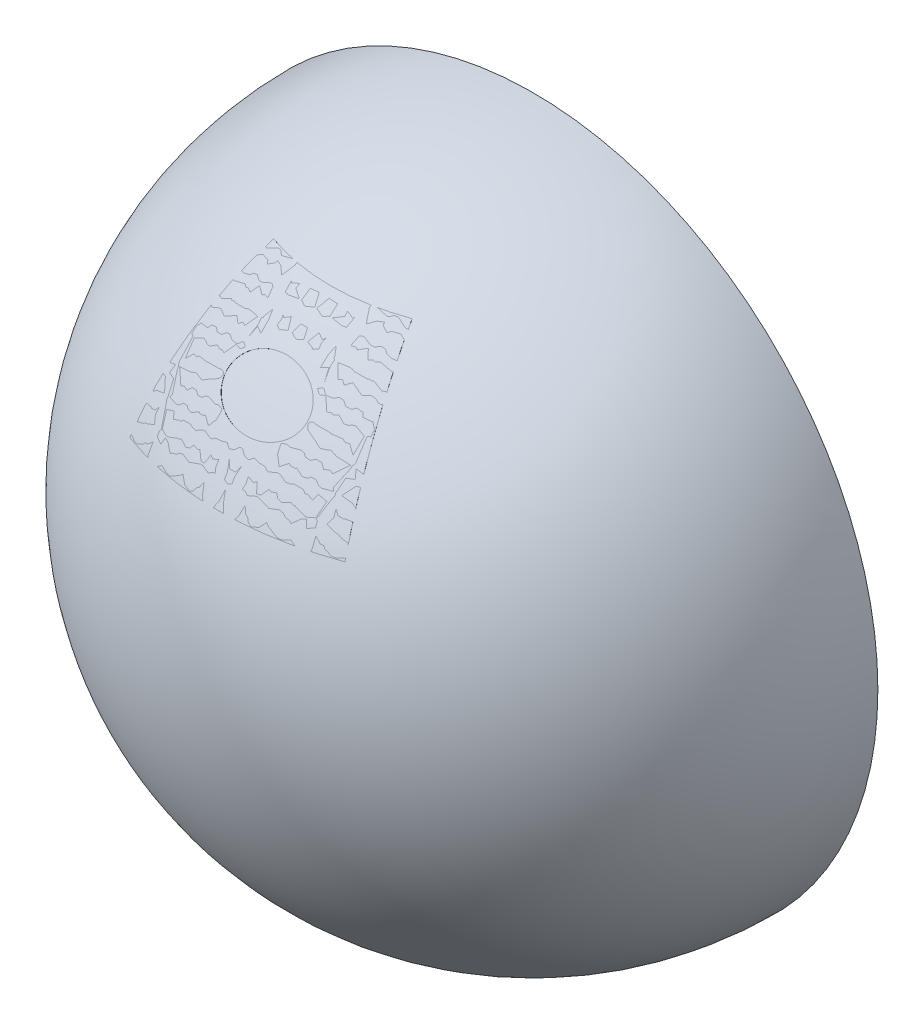
ISO-10303-21;
HEADER;
FILE_DESCRIPTION(('STEP AP214'),'2;1');
FILE_NAME('part.step','',(''),(''),'','','');
FILE_SCHEMA(('AUTOMOTIVE_DESIGN { 1 0 10303 214 1 1 1 1 }'));
ENDSEC;
DATA;
#1=APPLICATION_CONTEXT('core data for automotive mechanical design processes');
#2=APPLICATION_PROTOCOL_DEFINITION('international standard','automotive_design',2000,#1);
#3=PRODUCT_CONTEXT('',#1,'mechanical');
#4=PRODUCT('Part','Part','',(#3));
#5=PRODUCT_RELATED_PRODUCT_CATEGORY('part','',(#4));
#6=PRODUCT_DEFINITION_FORMATION('','',#4);
#7=PRODUCT_DEFINITION_CONTEXT('part definition',#1,'design');
#8=PRODUCT_DEFINITION('design','',#6,#7);
#9=PRODUCT_DEFINITION_SHAPE('','',#8);
#10=(LENGTH_UNIT() NAMED_UNIT(*) SI_UNIT(.MILLI.,.METRE.));
#11=(NAMED_UNIT(*) PLANE_ANGLE_UNIT() SI_UNIT($,.RADIAN.));
#12=(NAMED_UNIT(*) SI_UNIT($,.STERADIAN.) SOLID_ANGLE_UNIT());
#13=UNCERTAINTY_MEASURE_WITH_UNIT(LENGTH_MEASURE(1.E-05),#10,'distance_accuracy_value','');
#14=(GEOMETRIC_REPRESENTATION_CONTEXT(3) GLOBAL_UNCERTAINTY_ASSIGNED_CONTEXT((#13)) GLOBAL_UNIT_ASSIGNED_CONTEXT((#10,
#11,#12)) REPRESENTATION_CONTEXT('',''));
#15=CARTESIAN_POINT('',(0.,0.,0.));
#16=DIRECTION('',(0.,0.,1.));
#17=DIRECTION('',(1.,0.,0.));
#18=AXIS2_PLACEMENT_3D('',#15,#16,#17);
#19=CARTESIAN_POINT('',(0.,0.,0.));
#20=DIRECTION('',(0.,-1.,0.));
#21=DIRECTION('',(0.342020143325725,0.,0.939692620785888));
#22=AXIS2_PLACEMENT_3D('',#19,#20,#21);
#23=SPHERICAL_SURFACE('',#22,100.);
#24=CARTESIAN_POINT('',(0.,40.6615853437039,0.));
#25=DIRECTION('',(0.,-1.,0.));
#26=DIRECTION('',(0.,0.,-1.));
#27=AXIS2_PLACEMENT_3D('',#24,#25,#26);
#28=CIRCLE('',#27,91.3599227086838);
#29=CARTESIAN_POINT('',(31.2469338590512,40.6615853437039,85.8502452049193));
#30=VERTEX_POINT('',#29);
#31=CARTESIAN_POINT('',(-31.2469338590512,40.6615853437039,85.8502452049192));
#32=VERTEX_POINT('',#31);
#33=EDGE_CURVE('E62',#30,#32,#28,.T.);
#34=ORIENTED_EDGE('',*,*,#33,.F.);
#35=CARTESIAN_POINT('',(0.,0.,0.));
#36=DIRECTION('',(0.939692620785888,0.,-0.342020143325725));
#37=DIRECTION('',(-0.342020143325725,0.,-0.939692620785888));
#38=AXIS2_PLACEMENT_3D('',#35,#36,#37);
#39=CIRCLE('',#38,100.);
#40=CARTESIAN_POINT('',(20.1070978887584,80.8939272201377,55.2437974201172));
#41=VERTEX_POINT('',#40);
#42=EDGE_CURVE('E101',#41,#30,#39,.T.);
#43=ORIENTED_EDGE('',*,*,#42,.F.);
#44=CARTESIAN_POINT('',(0.,80.8939272201377,0.));
#45=DIRECTION('',(0.,-1.,0.));
#46=DIRECTION('',(0.,0.,-1.));
#47=AXIS2_PLACEMENT_3D('',#44,#45,#46);
#48=CIRCLE('',#47,58.7892212816521);
#49=CARTESIAN_POINT('',(-20.1070978887584,80.8939272201377,55.2437974201172));
#50=VERTEX_POINT('',#49);
#51=EDGE_CURVE('E12',#41,#50,#48,.T.);
#52=ORIENTED_EDGE('',*,*,#51,.T.);
#53=CARTESIAN_POINT('',(0.,0.,0.));
#54=DIRECTION('',(0.939692620785888,0.,0.342020143325725));
#55=DIRECTION('',(0.342020143325725,0.,-0.939692620785888));
#56=AXIS2_PLACEMENT_3D('',#53,#54,#55);
#57=CIRCLE('',#56,100.);
#58=EDGE_CURVE('E113',#50,#32,#57,.T.);
#59=ORIENTED_EDGE('',*,*,#58,.T.);
#60=EDGE_LOOP('',(#34,#43,#52,#59));
#61=FACE_BOUND('',#60,.T.);
#62=CARTESIAN_POINT('',(12.,62.467083899545,77.1612819300406));
#63=CARTESIAN_POINT('',(11.9999979099001,62.632940677866,77.0270102711229));
#64=CARTESIAN_POINT('',(11.9905593447313,62.7991389124824,76.8930437586298));
#65=CARTESIAN_POINT('',(11.9529497623185,63.1308788013271,76.6267888699449));
#66=CARTESIAN_POINT('',(11.9247666663263,63.296419962907,76.4945016319085));
#67=CARTESIAN_POINT('',(11.8500480798009,63.6258760013341,76.2323426723591));
#68=CARTESIAN_POINT('',(11.8034721647999,63.7897864751422,76.1024769357889));
#69=CARTESIAN_POINT('',(11.6927114369915,64.1144340496298,75.846329338333));
#70=CARTESIAN_POINT('',(11.6285248761859,64.2751708335963,75.720047834585));
#71=CARTESIAN_POINT('',(11.4838947037357,64.5915637969626,75.4724809758918));
#72=CARTESIAN_POINT('',(11.4035393652175,64.74724244977,75.3511726221929));
#73=CARTESIAN_POINT('',(11.2274547472868,65.0535312512461,75.1134320265442));
#74=CARTESIAN_POINT('',(11.1317249796048,65.2041412387575,74.9969999396055));
#75=CARTESIAN_POINT('',(10.9261339143453,65.4994735136611,74.7695382179018));
#76=CARTESIAN_POINT('',(10.8162813019629,65.6441993482535,74.6585053201336));
#77=CARTESIAN_POINT('',(10.5835682605334,65.9273356583054,74.442056767123));
#78=CARTESIAN_POINT('',(10.4607031237758,66.0657438220463,74.3366431657239));
#79=CARTESIAN_POINT('',(10.1901661732928,66.3494045638707,74.1213324800996));
#80=CARTESIAN_POINT('',(10.0412422324776,66.4939364848531,74.0120579211154));
#81=CARTESIAN_POINT('',(9.73061272046493,66.7743629644546,73.8007768182073));
#82=CARTESIAN_POINT('',(9.56890208826582,66.9102540642351,73.6987731828126));
#83=CARTESIAN_POINT('',(9.0665915658312,67.304619198394,73.4037109191131));
#84=CARTESIAN_POINT('',(8.70882449247469,67.5497732555577,73.221609875664));
#85=CARTESIAN_POINT('',(8.05405071018736,67.9452432022419,72.929409849018));
#86=CARTESIAN_POINT('',(7.76475267165602,68.1038168342198,72.8127809898265));
#87=CARTESIAN_POINT('',(7.17011142386365,68.40049262959,72.5953457852868));
#88=CARTESIAN_POINT('',(6.86476742100455,68.5385937791652,72.4945402235089));
#89=CARTESIAN_POINT('',(6.24073194969982,68.7945666084672,72.3082530660297));
#90=CARTESIAN_POINT('',(5.92202295778796,68.9124106265528,72.2227924172283));
#91=CARTESIAN_POINT('',(5.27436755445399,69.1278390243385,72.0669519023316));
#92=CARTESIAN_POINT('',(4.9454220639972,69.2254252205852,71.9965706840249));
#93=CARTESIAN_POINT('',(3.93782112662485,69.490479500049,71.805772843383));
#94=CARTESIAN_POINT('',(3.2464094421478,69.6270106820941,71.7080426809569));
#95=CARTESIAN_POINT('',(1.84711878597646,69.8195193650492,71.5704317247945));
#96=CARTESIAN_POINT('',(1.13923878215448,69.8754918031629,71.530554566888));
#97=CARTESIAN_POINT('',(0.0118024447734045,69.9011427784027,71.5122764904262));
#98=CARTESIAN_POINT('',(-0.407101821761114,69.896774861169,71.5153864771952));
#99=CARTESIAN_POINT('',(-1.24322204038162,69.8602342630153,71.5414373089546));
#100=CARTESIAN_POINT('',(-1.66043770494873,69.8280570318497,71.5643813992622));
#101=CARTESIAN_POINT('',(-2.49026630610415,69.73572909907,71.6303156291067));
#102=CARTESIAN_POINT('',(-2.90287809551635,69.6755715780846,71.6733106554752));
#103=CARTESIAN_POINT('',(-3.72027499634237,69.5270247272956,71.7797165868268));
#104=CARTESIAN_POINT('',(-4.12506174094732,69.4386413575693,71.8431231817928));
#105=CARTESIAN_POINT('',(-4.85675437174037,69.2504300012242,71.9785489421208));
#106=CARTESIAN_POINT('',(-5.18537807674632,69.1549776083522,72.0473618842681));
#107=CARTESIAN_POINT('',(-5.83249914164214,68.9440534143217,72.1998703671579));
#108=CARTESIAN_POINT('',(-6.15099667549687,68.8285819573054,72.2835656520627));
#109=CARTESIAN_POINT('',(-7.08689759651834,68.4519988174147,72.5574503420402));
#110=CARTESIAN_POINT('',(-7.68613730834349,68.160358699681,72.7706953204504));
#111=CARTESIAN_POINT('',(-8.68668350898109,67.5677891329789,73.2081503451324));
#112=CARTESIAN_POINT('',(-9.10271443572822,67.2826291986279,73.4199237166113));
#113=CARTESIAN_POINT('',(-9.67955366374514,66.819003124618,73.7672110700955));
#114=CARTESIAN_POINT('',(-9.86395020548683,66.6584970946742,73.8878984776449));
#115=CARTESIAN_POINT('',(-10.2148438664913,66.3259231637778,74.1390787838249));
#116=CARTESIAN_POINT('',(-10.3813438829415,66.1538571415711,74.2695700895183));
#117=CARTESIAN_POINT('',(-10.6674189655803,65.8290954827843,74.5170285125982));
#118=CARTESIAN_POINT('',(-10.790162102854,65.67806872149,74.6325321088978));
#119=CARTESIAN_POINT('',(-11.0201526295406,65.3692232096859,74.8697001446647));
#120=CARTESIAN_POINT('',(-11.1274030373286,65.211405789965,74.9913633778246));
#121=CARTESIAN_POINT('',(-11.3249664791211,64.889807798168,75.2403420840886));
#122=CARTESIAN_POINT('',(-11.4152844670005,64.7260289869989,75.3676558904954));
#123=CARTESIAN_POINT('',(-11.5776772099095,64.3934593922585,75.6273156615666));
#124=CARTESIAN_POINT('',(-11.64975172606,64.2246685430921,75.7596616920966));
#125=CARTESIAN_POINT('',(-11.7748188529049,63.8823190399411,76.0293011054535));
#126=CARTESIAN_POINT('',(-11.8277028945389,63.7087390592164,76.1666179471734));
#127=CARTESIAN_POINT('',(-11.9128756816667,63.3591081485694,76.4444797320384));
#128=CARTESIAN_POINT('',(-11.945164318464,63.1830572056111,76.5850246922165));
#129=CARTESIAN_POINT('',(-11.9885298309398,62.8300519363864,76.8681427848129));
#130=CARTESIAN_POINT('',(-11.9996126978951,62.6530978794483,77.0107153329039));
#131=CARTESIAN_POINT('',(-12.0003672423944,62.2998153552925,77.2966741111452));
#132=CARTESIAN_POINT('',(-11.9900405084208,62.123486842635,77.4400602801418));
#133=CARTESIAN_POINT('',(-11.9501462699259,61.7894161019998,77.712962219815));
#134=CARTESIAN_POINT('',(-11.9224698211457,61.6314787647772,77.8425202751835));
#135=CARTESIAN_POINT('',(-11.8501358229602,61.3184751037358,78.100328437489));
#136=CARTESIAN_POINT('',(-11.8054795580675,61.1634085636733,78.2285786426107));
#137=CARTESIAN_POINT('',(-11.6998505471122,60.8571225001043,78.482906116995));
#138=CARTESIAN_POINT('',(-11.638878212325,60.7059028797346,78.6089834409436));
#139=CARTESIAN_POINT('',(-11.5014642872647,60.4081449490185,78.8581939883191));
#140=CARTESIAN_POINT('',(-11.4250219475586,60.2616068658641,78.9813270687909));
#141=CARTESIAN_POINT('',(-11.2553177392154,59.9699104503137,79.227346740228));
#142=CARTESIAN_POINT('',(-11.1616466988686,59.8249042312505,79.3501309400494));
#143=CARTESIAN_POINT('',(-10.9601135258053,59.5411321833407,79.5912956146668));
#144=CARTESIAN_POINT('',(-10.8522458125782,59.4023688374112,79.7096743341355));
#145=CARTESIAN_POINT('',(-10.6235168800074,59.1315699905286,79.9414984229285));
#146=CARTESIAN_POINT('',(-10.5026539237409,58.9995353924138,80.0549431299276));
#147=CARTESIAN_POINT('',(-10.2491129883252,58.7425121220884,80.2765086103036));
#148=CARTESIAN_POINT('',(-10.1164327618842,58.6175247974706,80.3846283649364));
#149=CARTESIAN_POINT('',(-9.78434371787816,58.3255260624197,80.6380076873672));
#150=CARTESIAN_POINT('',(-9.57971075541477,58.1620512018419,80.78052746847));
#151=CARTESIAN_POINT('',(-9.15228885929698,57.8497189435653,81.0538983444601));
#152=CARTESIAN_POINT('',(-8.92949438871328,57.7008660344136,81.1847458551476));
#153=CARTESIAN_POINT('',(-8.46807905319696,57.4175932267504,81.434640368794));
#154=CARTESIAN_POINT('',(-8.22943356593606,57.283196674347,81.5536682606881));
#155=CARTESIAN_POINT('',(-7.73903084985458,57.0289725524227,81.7795375208583));
#156=CARTESIAN_POINT('',(-7.48727331348957,56.9091453248467,81.8863786031038));
#157=CARTESIAN_POINT('',(-6.90519161072245,56.6542443081983,82.1142908925112));
#158=CARTESIAN_POINT('',(-6.571582335709,56.5234171045303,82.2317425479583));
#159=CARTESIAN_POINT('',(-5.8903873018866,56.284023276766,82.4472807288809));
#160=CARTESIAN_POINT('',(-5.54279754547108,56.175463074649,82.5453616673863));
#161=CARTESIAN_POINT('',(-4.83674623533143,55.9800536906207,82.7223155414885));
#162=CARTESIAN_POINT('',(-4.47828247799922,55.8932089427351,82.8011845541642));
#163=CARTESIAN_POINT('',(-3.75330743395891,55.7407685721674,82.9398664613426));
#164=CARTESIAN_POINT('',(-3.38679663831577,55.6751716566782,82.9996805152254));
#165=CARTESIAN_POINT('',(-2.64360680842059,55.564148485997,83.1010356396134));
#166=CARTESIAN_POINT('',(-2.26685840621806,55.5189757845594,83.1423469541279));
#167=CARTESIAN_POINT('',(-1.50980771050342,55.4496728868107,83.2057693721711));
#168=CARTESIAN_POINT('',(-1.12950413549593,55.4255505991726,83.2278732594265));
#169=CARTESIAN_POINT('',(0.0138405324081811,55.3845429235524,83.2654376978303));
#170=CARTESIAN_POINT('',(0.779562822510316,55.3989804056492,83.2521843118773));
#171=CARTESIAN_POINT('',(1.96690970390082,55.4871446721477,83.1714730800276));
#172=CARTESIAN_POINT('',(2.39293721484804,55.5322628408246,83.1301805775073));
#173=CARTESIAN_POINT('',(3.23836725242469,55.6495844946613,83.0230175047471));
#174=CARTESIAN_POINT('',(3.65776850885759,55.7217931087274,82.9571422803888));
#175=CARTESIAN_POINT('',(4.48585309488492,55.8937999019303,82.8006352866622));
#176=CARTESIAN_POINT('',(4.89454365053754,55.9935789269516,82.7100207050984));
#177=CARTESIAN_POINT('',(5.69740527513303,56.2214736614624,82.5037577477486));
#178=CARTESIAN_POINT('',(6.09158220519161,56.3495777825633,82.3881196100338));
#179=CARTESIAN_POINT('',(6.75194850419862,56.5945900994438,82.1678688722426));
#180=CARTESIAN_POINT('',(7.022828220899,56.7044322385395,82.0693749938388));
#181=CARTESIAN_POINT('',(7.55266036075219,56.9394293653338,81.8593529716325));
#182=CARTESIAN_POINT('',(7.81161389884698,57.0645829175991,81.7478260497117));
#183=CARTESIAN_POINT('',(8.31491041025572,57.3302698471668,81.5119450966804));
#184=CARTESIAN_POINT('',(8.55927284881573,57.470781992941,81.387608786448));
#185=CARTESIAN_POINT('',(9.03107315640507,57.7674447246747,81.1261777992783));
#186=CARTESIAN_POINT('',(9.25851590282529,57.9235907732079,80.9890868249389));
#187=CARTESIAN_POINT('',(9.65094619730708,58.2193842704986,80.7305631942478));
#188=CARTESIAN_POINT('',(9.81944809761567,58.3562846787361,80.6113128849741));
#189=CARTESIAN_POINT('',(10.1417997172639,58.6399387928386,80.3651831605697));
#190=CARTESIAN_POINT('',(10.295657667768,58.7866868834094,80.2383080974262));
#191=CARTESIAN_POINT('',(10.5871059693119,59.0898802430141,79.9772501527129));
#192=CARTESIAN_POINT('',(10.7246838718153,59.2463327950132,79.8430617920827));
#193=CARTESIAN_POINT('',(10.9815402622476,59.5682782334381,79.5681299103975));
#194=CARTESIAN_POINT('',(11.1008192694257,59.7337708631619,79.4273865754942));
#195=CARTESIAN_POINT('',(11.3202677212116,60.0746487417188,79.1388060879752));
#196=CARTESIAN_POINT('',(11.4202381855342,60.2501151220972,78.9909128822195));
#197=CARTESIAN_POINT('',(11.5977567271258,60.608260471862,78.6904904571186));
#198=CARTESIAN_POINT('',(11.6753087685381,60.7909381596062,78.5379620626697));
#199=CARTESIAN_POINT('',(11.8062385760122,61.1614753544746,78.2301015628579));
#200=CARTESIAN_POINT('',(11.8596902385691,61.3493171219411,78.0747795675891));
#201=CARTESIAN_POINT('',(11.9415654774879,61.7288725184523,77.7625056416292));
#202=CARTESIAN_POINT('',(11.9700118267189,61.920582461524,77.6055553259912));
#203=CARTESIAN_POINT('',(11.9904368112924,62.1720432167497,77.4007251868288));
#204=CARTESIAN_POINT('',(11.9940215590241,62.2309641943997,77.3528042355609));
#205=CARTESIAN_POINT('',(11.9988035167909,62.3489369657652,77.2570032535014));
#206=CARTESIAN_POINT('',(12.0000007447073,62.4079887584976,77.2091232224058));
#207=CARTESIAN_POINT('',(12.,62.467083899545,77.1612819300406));
#208=B_SPLINE_CURVE_WITH_KNOTS('',3,(#62,#63,#64,#65,#66,#67,#68,#69,#70,#71,#72,#73,#74,#75,
#76,#77,#78,#79,#80,#81,#82,#83,#84,#85,#86,#87,#88,#89,#90,#91,#92,#93,#94,#95,#96,#97,#98,#99,
#100,#101,#102,#103,#104,#105,#106,#107,#108,#109,#110,#111,#112,#113,#114,#115,#116,#117,#118,
#119,#120,#121,#122,#123,#124,#125,#126,#127,#128,#129,#130,#131,#132,#133,#134,#135,#136,#137,
#138,#139,#140,#141,#142,#143,#144,#145,#146,#147,#148,#149,#150,#151,#152,#153,#154,#155,#156,
#157,#158,#159,#160,#161,#162,#163,#164,#165,#166,#167,#168,#169,#170,#171,#172,#173,#174,#175,
#176,#177,#178,#179,#180,#181,#182,#183,#184,#185,#186,#187,#188,#189,#190,#191,#192,#193,#194,
#195,#196,#197,#198,#199,#200,#201,#202,#203,#204,#205,#206,#207),.UNSPECIFIED.,.T.,.F.,(4,2,2,
2,2,2,2,2,2,2,2,2,2,2,2,2,2,2,2,2,2,2,2,2,2,2,2,2,2,2,2,2,2,2,2,2,2,2,2,2,2,2,2,2,2,2,2,2,2,2,2,
2,2,2,2,2,2,2,2,2,2,2,2,2,2,2,2,2,2,2,2,2,4),(0.,0.640104194244087,1.28062126400936,
1.92255399333761,2.56455046271624,3.20313268640758,3.84173519454843,4.47994684013641,
5.11839017373738,5.8213175319772,6.52452451669233,7.93099415465987,8.97952282923378,
10.0281034106233,11.0781046737742,12.1280117411604,14.2543907672542,16.3809034219691,
17.6364921543426,18.8922863689126,20.1483868068313,21.404222185898,22.4503508708901,
23.4964615739566,25.5842467447267,27.218664720111,28.035717828197,28.8526384674151,
29.5309097392425,30.209048687952,30.8869889246032,31.5649380377121,32.2466649209934,
32.9283954022006,33.6099332452952,34.2914205235924,34.90913193755,35.5267966313198,
36.1444457572302,36.7621248118614,37.3970081079122,38.0321417171454,38.6673603230753,
39.3026999875982,40.1959439375147,41.0894612380697,41.9844005082609,42.8793607788044,
44.009097144137,45.1391588776504,46.2694511676357,47.3996746729762,48.5435678944418,
49.6878906935604,51.9757870245588,53.2657158346202,54.5558889841686,55.8451680498411,
57.1339206172897,58.0584869429048,58.9829666574554,59.9061841703592,60.8291345103644,
61.5715533056371,62.3135523020304,63.0561150509514,63.7986567250236,64.5484839974849,
65.29817860033,66.0455585939587,66.7922572254777,67.0203294896013,67.2484000455764),.UNSPECIFIED.);
#209=CARTESIAN_POINT('',(12.,62.467083899545,77.1612819300406));
#210=VERTEX_POINT('',#209);
#211=EDGE_CURVE('E116',#210,#210,#208,.T.);
#212=ORIENTED_EDGE('',*,*,#211,.F.);
#213=EDGE_LOOP('',(#212));
#214=FACE_BOUND('',#213,.T.);
#215=ADVANCED_FACE('F49',(#61,#214),#23,.T.);
#216=CARTESIAN_POINT('',(0.,80.8939272201377,0.));
#217=DIRECTION('',(0.,1.,0.));
#218=DIRECTION('',(0.,0.,1.));
#219=AXIS2_PLACEMENT_3D('',#216,#217,#218);
#220=CONICAL_SURFACE('',#219,58.7892212816521,0.628450747547426);
#221=ORIENTED_EDGE('',*,*,#51,.F.);
#222=DIRECTION('',(-0.201070978887584,-0.808939272201377,-0.552437974201172));
#223=VECTOR('',#222,1.);
#224=CARTESIAN_POINT('',(20.1070978887584,80.8939272201377,55.2437974201172));
#225=LINE('',#224,#223);
#226=CARTESIAN_POINT('',(19.1017429943205,76.8492308591309,52.4816075491113));
#227=VERTEX_POINT('',#226);
#228=EDGE_CURVE('E96',#41,#227,#225,.T.);
#229=ORIENTED_EDGE('',*,*,#228,.T.);
#230=CARTESIAN_POINT('',(0.,76.8492308591309,0.));
#231=DIRECTION('',(0.,-1.,0.));
#232=DIRECTION('',(0.,0.,-1.));
#233=AXIS2_PLACEMENT_3D('',#230,#231,#232);
#234=CIRCLE('',#233,55.8497602175695);
#235=CARTESIAN_POINT('',(-19.1017429943205,76.8492308591309,52.4816075491113));
#236=VERTEX_POINT('',#235);
#237=EDGE_CURVE('E90',#227,#236,#234,.T.);
#238=ORIENTED_EDGE('',*,*,#237,.T.);
#239=DIRECTION('',(0.201070978887585,-0.808939272201377,-0.552437974201172));
#240=VECTOR('',#239,1.);
#241=CARTESIAN_POINT('',(-20.1070978887584,80.8939272201377,55.2437974201172));
#242=LINE('',#241,#240);
#243=EDGE_CURVE('E94',#50,#236,#242,.T.);
#244=ORIENTED_EDGE('',*,*,#243,.F.);
#245=EDGE_LOOP('',(#221,#229,#238,#244));
#246=FACE_BOUND('',#245,.T.);
#247=ADVANCED_FACE('F92',(#246),#220,.F.);
#248=CARTESIAN_POINT('',(0.,40.6615853437039,0.));
#249=DIRECTION('',(0.,1.,0.));
#250=DIRECTION('',(0.,0.,1.));
#251=AXIS2_PLACEMENT_3D('',#248,#249,#250);
#252=CONICAL_SURFACE('',#251,91.3599227086838,1.1520495231457);
#253=CARTESIAN_POINT('',(0.,38.6285060765187,0.));
#254=DIRECTION('',(0.,-1.,0.));
#255=DIRECTION('',(0.,0.,-1.));
#256=AXIS2_PLACEMENT_3D('',#253,#254,#255);
#257=CIRCLE('',#256,86.7919265732497);
#258=CARTESIAN_POINT('',(29.6845871660987,38.6285060765187,81.5577329446733));
#259=VERTEX_POINT('',#258);
#260=CARTESIAN_POINT('',(-29.6845871660987,38.6285060765187,81.5577329446733));
#261=VERTEX_POINT('',#260);
#262=EDGE_CURVE('E100',#259,#261,#257,.T.);
#263=ORIENTED_EDGE('',*,*,#262,.F.);
#264=DIRECTION('',(-0.312469338590511,-0.406615853437048,-0.858502452049189));
#265=VECTOR('',#264,1.);
#266=CARTESIAN_POINT('',(31.2469338590512,40.6615853437039,85.8502452049193));
#267=LINE('',#266,#265);
#268=EDGE_CURVE('E128',#30,#259,#267,.T.);
#269=ORIENTED_EDGE('',*,*,#268,.F.);
#270=ORIENTED_EDGE('',*,*,#33,.T.);
#271=DIRECTION('',(0.312469338590511,-0.406615853437048,-0.858502452049189));
#272=VECTOR('',#271,1.);
#273=CARTESIAN_POINT('',(-31.2469338590512,40.6615853437039,85.8502452049192));
#274=LINE('',#273,#272);
#275=EDGE_CURVE('E109',#32,#261,#274,.T.);
#276=ORIENTED_EDGE('',*,*,#275,.T.);
#277=EDGE_LOOP('',(#263,#269,#270,#276));
#278=FACE_BOUND('',#277,.T.);
#279=ADVANCED_FACE('F135',(#278),#252,.T.);
#280=CARTESIAN_POINT('',(0.,0.,0.));
#281=DIRECTION('',(0.,-1.,0.));
#282=DIRECTION('',(0.342020143325725,0.,0.939692620785888));
#283=AXIS2_PLACEMENT_3D('',#280,#281,#282);
#284=SPHERICAL_SURFACE('',#283,95.);
#285=CARTESIAN_POINT('',(12.,59.2968769078645,73.2453438040506));
#286=CARTESIAN_POINT('',(11.9999979057663,59.1310334180509,73.3796051302067));
#287=CARTESIAN_POINT('',(11.9905608388899,58.9654326299019,73.5142825465705));
#288=CARTESIAN_POINT('',(11.9529572776658,58.6360390392981,73.7833813911367));
#289=CARTESIAN_POINT('',(11.924778719645,58.4722474704969,73.9178025984932));
#290=CARTESIAN_POINT('',(11.8500723944058,58.1473944566781,74.1855922696494));
#291=CARTESIAN_POINT('',(11.8035042453127,57.9863398390966,74.3189577532732));
#292=CARTESIAN_POINT('',(11.6927622795829,57.6684228463367,74.5833636779133));
#293=CARTESIAN_POINT('',(11.6285867148194,57.5115608891184,74.7144038866922));
#294=CARTESIAN_POINT('',(11.4839818515856,57.2038042131773,74.9725834735958));
#295=CARTESIAN_POINT('',(11.4036408436581,57.0528821872098,75.0997398960322));
#296=CARTESIAN_POINT('',(11.2275880742439,56.7568820536529,75.3501356144118));
#297=CARTESIAN_POINT('',(11.1318758253319,56.6118041315638,75.4733747859896));
#298=CARTESIAN_POINT('',(10.9263226895103,56.3281735448909,75.7152402640196));
#299=CARTESIAN_POINT('',(10.8164904725916,56.1896169467951,75.833869343445));
#300=CARTESIAN_POINT('',(10.5838209213148,55.9193245683025,76.066136925889));
#301=CARTESIAN_POINT('',(10.4609788802627,55.7875912822855,76.1797736015753));
#302=CARTESIAN_POINT('',(10.1904852253699,55.5183340951646,76.4128489732892));
#303=CARTESIAN_POINT('',(10.0415809570828,55.3815704361474,76.5317134086301));
#304=CARTESIAN_POINT('',(9.73099175019277,55.1169560768647,76.7625167732444));
#305=CARTESIAN_POINT('',(9.56930175096822,54.9891089438409,76.8744529287228));
#306=CARTESIAN_POINT('',(9.06705404898807,54.6190493823519,77.199531005239));
#307=CARTESIAN_POINT('',(8.70933007790802,54.390329975349,77.4019328292981));
#308=CARTESIAN_POINT('',(8.05462561810018,54.0229261892978,77.728817544262));
#309=CARTESIAN_POINT('',(7.76535369508152,53.876141654614,77.860021619079));
#310=CARTESIAN_POINT('',(7.17076248659619,53.6022881213491,78.1056783482259));
#311=CARTESIAN_POINT('',(6.86544240852977,53.4752200977708,78.2201301741232));
#312=CARTESIAN_POINT('',(6.24145189671365,53.2402539664639,78.4324054490843));
#313=CARTESIAN_POINT('',(5.92276393742467,53.1323820616345,78.5302061614539));
#314=CARTESIAN_POINT('',(5.27514724640981,52.9355700231235,78.7090902171912));
#315=CARTESIAN_POINT('',(4.94621943604717,52.8466281917594,78.7901750596471));
#316=CARTESIAN_POINT('',(3.93867456957215,52.6054154492053,79.0105010396356));
#317=CARTESIAN_POINT('',(3.24729614642492,52.481709854589,79.1241325475351));
#318=CARTESIAN_POINT('',(1.84806066189354,52.3074542750682,79.2844165274506));
#319=CARTESIAN_POINT('',(1.14020258215643,52.2569088233191,79.3310648490471));
#320=CARTESIAN_POINT('',(0.0128579967355328,52.2337049675771,79.3524758867934));
#321=CARTESIAN_POINT('',(-0.405974117692987,52.2376225832735,79.3488581019123));
#322=CARTESIAN_POINT('',(-1.24195250073921,52.2705638724135,79.3184772307656));
#323=CARTESIAN_POINT('',(-1.65909848260235,52.2995916495248,79.2917103613246));
#324=CARTESIAN_POINT('',(-2.48879128875577,52.383000276919,79.2149139735506));
#325=CARTESIAN_POINT('',(-2.90133696190518,52.4373873333124,79.1648787608242));
#326=CARTESIAN_POINT('',(-3.71860614036866,52.5719331866405,79.041375721348));
#327=CARTESIAN_POINT('',(-4.12333127484428,52.6520865532622,78.9679128320645));
#328=CARTESIAN_POINT('',(-4.85502782085508,52.8232063154438,78.811542585513));
#329=CARTESIAN_POINT('',(-5.18371343135513,52.9101424880218,78.7322513606885));
#330=CARTESIAN_POINT('',(-5.83095735395365,53.102708104548,78.5571396888242));
#331=CARTESIAN_POINT('',(-6.14951583867574,53.2083372296605,78.4613195237103));
#332=CARTESIAN_POINT('',(-7.08559845279439,53.5537673941314,78.1490390791046));
#333=CARTESIAN_POINT('',(-7.68495739023085,53.822436081918,77.9074596129431));
#334=CARTESIAN_POINT('',(-8.68570043209511,54.3725328816417,77.4175963920166));
#335=CARTESIAN_POINT('',(-9.10181096342264,54.6385182022462,77.1821627405405));
#336=CARTESIAN_POINT('',(-9.67877111592839,55.073967473314,76.8000903827953));
#337=CARTESIAN_POINT('',(-9.86320816719767,55.2251795637937,76.6679266477439));
#338=CARTESIAN_POINT('',(-10.2141832187764,55.5396160885275,76.3943430311783));
#339=CARTESIAN_POINT('',(-10.3807241185058,55.7028385696937,76.2529246550335));
#340=CARTESIAN_POINT('',(-10.666858220417,56.0120660978208,75.986299858158));
#341=CARTESIAN_POINT('',(-10.7896212136696,56.1562877769141,75.8624187362435));
#342=CARTESIAN_POINT('',(-11.0196547475901,56.4521895339469,75.6093156559989));
#343=CARTESIAN_POINT('',(-11.126928307599,56.6038681505642,75.4800947448826));
#344=CARTESIAN_POINT('',(-11.3245410964616,56.9140185596484,75.2170217452782));
#345=CARTESIAN_POINT('',(-11.4148852821441,57.0724883469477,75.0831710260124));
#346=CARTESIAN_POINT('',(-11.5773330158919,57.3954210197495,74.8116441710388));
#347=CARTESIAN_POINT('',(-11.6494363251844,57.5598839836704,74.673967985282));
#348=CARTESIAN_POINT('',(-11.7745635395431,57.8946736339396,74.3950138896457));
#349=CARTESIAN_POINT('',(-11.8274787505195,58.0650279162333,74.253720170343));
#350=CARTESIAN_POINT('',(-11.9127146744602,58.4094432145349,73.9694250903095));
#351=CARTESIAN_POINT('',(-11.9450352788105,58.5835042500867,73.8264237205767));
#352=CARTESIAN_POINT('',(-11.9884646492583,58.9338346152675,73.5399993452018));
#353=CARTESIAN_POINT('',(-11.9995794223734,59.1101033052843,73.3965764704935));
#354=CARTESIAN_POINT('',(-12.0003970325691,59.4633431710469,73.1105527789298));
#355=CARTESIAN_POINT('',(-11.9901014606182,59.6403142936207,72.9679519017828));
#356=CARTESIAN_POINT('',(-11.9502675968704,59.9768349853938,72.698093485522));
#357=CARTESIAN_POINT('',(-11.9226224424745,60.136463423636,72.5706501073148));
#358=CARTESIAN_POINT('',(-11.8503536098634,60.4538715868824,72.3183305353449));
#359=CARTESIAN_POINT('',(-11.8057312173186,60.6116514509451,72.1934541479409));
#360=CARTESIAN_POINT('',(-11.70017220693,60.924311306601,71.9470407201085));
#361=CARTESIAN_POINT('',(-11.6392359979364,61.0791913707637,71.825503596077));
#362=CARTESIAN_POINT('',(-11.5018963040231,61.3851211611855,71.5864211238115));
#363=CARTESIAN_POINT('',(-11.4254920695527,61.5361707014254,71.4688759693432));
#364=CARTESIAN_POINT('',(-11.2558697850057,61.8377605216507,71.2351146958246));
#365=CARTESIAN_POINT('',(-11.1622431304378,61.9881697449093,71.1190265107268));
#366=CARTESIAN_POINT('',(-10.9608011713207,62.2834010863168,70.8920561341771));
#367=CARTESIAN_POINT('',(-10.8529802874982,62.428220978391,70.7811760132136));
#368=CARTESIAN_POINT('',(-10.6243469946149,62.7116507872126,70.5649838472693));
#369=CARTESIAN_POINT('',(-10.5035328484533,62.8502598701041,70.4596725496126));
#370=CARTESIAN_POINT('',(-10.2500910443508,63.1208164690584,70.2548434793992));
#371=CARTESIAN_POINT('',(-10.1174611391696,63.2527627104061,70.1553268149015));
#372=CARTESIAN_POINT('',(-9.78547975948993,63.5618259413024,69.9230099141299));
#373=CARTESIAN_POINT('',(-9.58090304844907,63.7355304386633,69.7931022598888));
#374=CARTESIAN_POINT('',(-9.15359183864231,64.0684910012823,69.5451581180153));
#375=CARTESIAN_POINT('',(-8.93085180107325,64.2277426277025,69.4271252762346));
#376=CARTESIAN_POINT('',(-8.46954290903805,64.5316996010211,69.2027138676624));
#377=CARTESIAN_POINT('',(-8.23094942611802,64.6763813930924,69.0963541484582));
#378=CARTESIAN_POINT('',(-7.74064764854914,64.9507854901459,68.8953328936045));
#379=CARTESIAN_POINT('',(-7.48893904683205,65.0805074446401,68.8006716320297));
#380=CARTESIAN_POINT('',(-6.90698730587247,65.3570905078424,68.5994609971457));
#381=CARTESIAN_POINT('',(-6.57345927375214,65.4995251859852,68.496303958137));
#382=CARTESIAN_POINT('',(-5.89242224563085,65.76079220457,68.3076831055343));
#383=CARTESIAN_POINT('',(-5.54490925283801,65.8796177392658,68.2222243934912));
#384=CARTESIAN_POINT('',(-4.83900625609154,66.0939264449858,68.0684867138691));
#385=CARTESIAN_POINT('',(-4.48061405204612,66.1894048587146,68.0002112475289));
#386=CARTESIAN_POINT('',(-3.75577631871235,66.3572577568326,67.8804132106402));
#387=CARTESIAN_POINT('',(-3.38933128072115,66.4296336465293,67.8288896210854));
#388=CARTESIAN_POINT('',(-2.64627303226868,66.5522689030652,67.7417011923436));
#389=CARTESIAN_POINT('',(-2.2695904633043,66.6022505228758,67.7062354583267));
#390=CARTESIAN_POINT('',(-1.51266564791785,66.6790039085484,67.6518147496683));
#391=CARTESIAN_POINT('',(-1.13242211779909,66.7057669509975,67.6328659805752));
#392=CARTESIAN_POINT('',(0.0107494655036064,66.7513327581201,67.600593160984));
#393=CARTESIAN_POINT('',(0.776367139994399,66.7354526814063,67.6118139458001));
#394=CARTESIAN_POINT('',(1.96353694974001,66.6381401655153,67.680784640857));
#395=CARTESIAN_POINT('',(2.38948431020261,66.5883260570476,67.7161015195847));
#396=CARTESIAN_POINT('',(3.23476376986732,66.4589654343589,67.8080146377621));
#397=CARTESIAN_POINT('',(3.65409460279029,66.3794132990748,67.8646149001958));
#398=CARTESIAN_POINT('',(4.48205301170303,66.190303705926,67.9995571067131));
#399=CARTESIAN_POINT('',(4.89068776295471,66.0807669588484,68.0778840443764));
#400=CARTESIAN_POINT('',(5.69345557317051,65.8312711896925,68.2569614701456));
#401=CARTESIAN_POINT('',(6.08759447185879,65.691324578877,68.3577028105987));
#402=CARTESIAN_POINT('',(6.74807766353987,65.4245079638251,68.5506556369356));
#403=CARTESIAN_POINT('',(7.01910051497329,65.3050906296921,68.6372530050273));
#404=CARTESIAN_POINT('',(7.54921959652214,65.0502928467037,68.8226977001232));
#405=CARTESIAN_POINT('',(7.8083169384891,64.9149138902076,68.9215438819476));
#406=CARTESIAN_POINT('',(8.3119010930865,64.6283877332904,69.1316037650179));
#407=CARTESIAN_POINT('',(8.55640736750762,64.4772623101274,69.2428003993592));
#408=CARTESIAN_POINT('',(9.02849478589923,64.1592630972814,69.477838106233));
#409=CARTESIAN_POINT('',(9.25608080897733,63.9923938792036,69.601675509052));
#410=CARTESIAN_POINT('',(9.64873757464981,63.6774779856047,69.8365376142298));
#411=CARTESIAN_POINT('',(9.8173252261253,63.532140555795,69.9453254592822));
#412=CARTESIAN_POINT('',(10.1398515676232,63.231956124987,70.1709651252429));
#413=CARTESIAN_POINT('',(10.2937984880111,63.0771145483231,70.2878123510191));
#414=CARTESIAN_POINT('',(10.5854275646982,62.7582728224935,70.5294920000885));
#415=CARTESIAN_POINT('',(10.7230972818791,62.5942658082106,70.654330419425));
#416=CARTESIAN_POINT('',(10.9801392421595,62.2579708658423,70.911514761795));
#417=CARTESIAN_POINT('',(11.0995120033651,62.0856831724186,71.0438604721027));
#418=CARTESIAN_POINT('',(11.3191505544558,61.7321237945064,71.3167880684424));
#419=CARTESIAN_POINT('',(11.4192171438118,61.5507804860265,71.4574380867212));
#420=CARTESIAN_POINT('',(11.5969257744322,61.1820805846325,71.7448732725936));
#421=CARTESIAN_POINT('',(11.6745717862722,60.9947250629903,71.8916573485981));
#422=CARTESIAN_POINT('',(11.8056845711559,60.6162207767711,72.189762042834));
#423=CARTESIAN_POINT('',(11.859225263901,60.4250855111797,72.3410672537621));
#424=CARTESIAN_POINT('',(11.9412712454433,60.0404462284595,72.6471806451344));
#425=CARTESIAN_POINT('',(11.969799309302,59.8469445292244,72.8019855069467));
#426=CARTESIAN_POINT('',(11.9903463525129,59.5939044056881,73.0055066344079));
#427=CARTESIAN_POINT('',(11.9939650022958,59.5344827967805,73.0533777259697));
#428=CARTESIAN_POINT('',(11.9987921920949,59.415656058693,73.1492627032462));
#429=CARTESIAN_POINT('',(12.0000007497616,59.3562509293955,73.1972765879124));
#430=CARTESIAN_POINT('',(12.,59.2968769078645,73.2453438040506));
#431=B_SPLINE_CURVE_WITH_KNOTS('',3,(#285,#286,#287,#288,#289,#290,#291,#292,#293,#294,#295,
#296,#297,#298,#299,#300,#301,#302,#303,#304,#305,#306,#307,#308,#309,#310,#311,#312,#313,#314,
#315,#316,#317,#318,#319,#320,#321,#322,#323,#324,#325,#326,#327,#328,#329,#330,#331,#332,#333,
#334,#335,#336,#337,#338,#339,#340,#341,#342,#343,#344,#345,#346,#347,#348,#349,#350,#351,#352,
#353,#354,#355,#356,#357,#358,#359,#360,#361,#362,#363,#364,#365,#366,#367,#368,#369,#370,#371,
#372,#373,#374,#375,#376,#377,#378,#379,#380,#381,#382,#383,#384,#385,#386,#387,#388,#389,#390,
#391,#392,#393,#394,#395,#396,#397,#398,#399,#400,#401,#402,#403,#404,#405,#406,#407,#408,#409,
#410,#411,#412,#413,#414,#415,#416,#417,#418,#419,#420,#421,#422,#423,#424,#425,#426,#427,#428,
#429,#430),.UNSPECIFIED.,.T.,.F.,(4,2,2,2,2,2,2,2,2,2,2,2,2,2,2,2,2,2,2,2,2,2,2,2,2,2,2,2,2,2,2,
2,2,2,2,2,2,2,2,2,2,2,2,2,2,2,2,2,2,2,2,2,2,2,2,2,2,2,2,2,2,2,2,2,2,2,2,2,2,2,2,2,4),(0.,
0.640053339802165,1.28051907351425,1.92239910311896,2.56434288392876,3.20287135867935,
3.84142008529525,4.47957858415859,5.11796874980639,5.82087564634618,6.52406216115714,
7.93049083252548,8.97900762266577,10.0275762465815,11.0775653780956,12.127460305013,
14.2537896010478,16.380250643248,17.6356220022399,18.8911985610423,20.1470825552425,
21.4027020421484,22.4489991244008,23.495278362248,25.5834018198297,27.2180369051998,
28.0351980637693,28.8522266308735,29.530505551906,30.2086520776402,30.8865997344472,
31.5645562651175,32.2462953150964,32.9280379604697,33.6095874585668,34.2910863136228,
34.9087382982036,35.5263435178796,36.1439332608307,36.7615529381624,37.3963536829578,
38.031404695732,38.666540715813,39.3017977914174,40.1949930749047,41.0884617591575,
41.9833524616873,42.8782641259869,44.0078582553302,45.1377775388967,46.267926867478,
47.3980074369027,48.5417402262451,49.6859025396541,51.9734737044398,53.2631233299261,
54.553016847543,55.8420216561668,57.1305013644626,58.055411539885,58.9802353077177,
59.9037966129619,60.8270905596174,61.5696565996135,62.3118027035949,63.0545123428155,
63.7972009472004,64.5471847848792,65.297035722487,66.0445712904828,66.7914254865801,
67.0205741805718,67.2497211963584),.UNSPECIFIED.);
#432=CARTESIAN_POINT('',(12.,59.2968769078645,73.2453438040506));
#433=VERTEX_POINT('',#432);
#434=EDGE_CURVE('E52',#433,#433,#431,.T.);
#435=ORIENTED_EDGE('',*,*,#434,.F.);
#436=EDGE_LOOP('',(#435));
#437=FACE_BOUND('',#436,.T.);
#438=CARTESIAN_POINT('',(0.,0.,0.));
#439=DIRECTION('',(0.939692620785888,0.,-0.342020143325725));
#440=DIRECTION('',(-0.342020143325725,0.,-0.939692620785888));
#441=AXIS2_PLACEMENT_3D('',#438,#439,#440);
#442=CIRCLE('',#441,95.);
#443=EDGE_CURVE('E126',#227,#259,#442,.T.);
#444=ORIENTED_EDGE('',*,*,#443,.T.);
#445=ORIENTED_EDGE('',*,*,#262,.T.);
#446=CARTESIAN_POINT('',(0.,0.,0.));
#447=DIRECTION('',(0.939692620785888,0.,0.342020143325725));
#448=DIRECTION('',(0.342020143325725,0.,-0.939692620785888));
#449=AXIS2_PLACEMENT_3D('',#446,#447,#448);
#450=CIRCLE('',#449,95.);
#451=EDGE_CURVE('E104',#236,#261,#450,.T.);
#452=ORIENTED_EDGE('',*,*,#451,.F.);
#453=ORIENTED_EDGE('',*,*,#237,.F.);
#454=EDGE_LOOP('',(#444,#445,#452,#453));
#455=FACE_BOUND('',#454,.T.);
#456=ADVANCED_FACE('F105',(#437,#455),#284,.F.);
#457=CARTESIAN_POINT('',(0.,0.,0.));
#458=DIRECTION('',(0.939692620785888,0.,-0.342020143325725));
#459=DIRECTION('',(-0.342020143325725,0.,-0.939692620785888));
#460=AXIS2_PLACEMENT_3D('',#457,#458,#459);
#461=PLANE('',#460);
#462=ORIENTED_EDGE('',*,*,#228,.F.);
#463=ORIENTED_EDGE('',*,*,#42,.T.);
#464=ORIENTED_EDGE('',*,*,#268,.T.);
#465=ORIENTED_EDGE('',*,*,#443,.F.);
#466=EDGE_LOOP('',(#462,#463,#464,#465));
#467=FACE_BOUND('',#466,.T.);
#468=ADVANCED_FACE('F138',(#467),#461,.T.);
#469=CARTESIAN_POINT('',(0.,0.,0.));
#470=DIRECTION('',(0.939692620785888,0.,0.342020143325725));
#471=DIRECTION('',(0.342020143325725,0.,-0.939692620785888));
#472=AXIS2_PLACEMENT_3D('',#469,#470,#471);
#473=PLANE('',#472);
#474=ORIENTED_EDGE('',*,*,#243,.T.);
#475=ORIENTED_EDGE('',*,*,#451,.T.);
#476=ORIENTED_EDGE('',*,*,#275,.F.);
#477=ORIENTED_EDGE('',*,*,#58,.F.);
#478=EDGE_LOOP('',(#474,#475,#476,#477));
#479=FACE_BOUND('',#478,.T.);
#480=ADVANCED_FACE('F112',(#479),#473,.F.);
#481=CARTESIAN_POINT('',(12.,-1.06032874243056,-1.30975099085433));
#482=CARTESIAN_POINT('',(12.,68.0304168418958,84.0332835481366));
#483=CARTESIAN_POINT('',(12.,22.9396712575694,-1.30975099085433));
#484=CARTESIAN_POINT('',(12.,92.0304168418958,84.0332835481366));
#485=CARTESIAN_POINT('',(-12.,22.9396712575694,-1.30975099085433));
#486=CARTESIAN_POINT('',(-12.,92.0304168418958,84.0332835481366));
#487=CARTESIAN_POINT('',(-12.,-1.06032874243056,-1.30975099085433));
#488=CARTESIAN_POINT('',(-12.,68.0304168418958,84.0332835481366));
#489=CARTESIAN_POINT('',(-12.,-25.0603287424306,-1.30975099085433));
#490=CARTESIAN_POINT('',(-12.,44.0304168418958,84.0332835481366));
#491=CARTESIAN_POINT('',(12.,-25.0603287424306,-1.30975099085433));
#492=CARTESIAN_POINT('',(12.,44.0304168418958,84.0332835481366));
#493=CARTESIAN_POINT('',(12.,-1.06032874243056,-1.30975099085433));
#494=CARTESIAN_POINT('',(12.,68.0304168418958,84.0332835481366));
#495=(BOUNDED_SURFACE() B_SPLINE_SURFACE(3,1,((#481,#482),(#483,#484),(#485,#486),(#487,#488),
(#489,#490),(#491,#492),(#493,#494)),.UNSPECIFIED.,.T.,.F.,.F.) B_SPLINE_SURFACE_WITH_KNOTS((4,
3,4),(2,2),(0.,0.5,1.),(0.,1.),
.UNSPECIFIED.) GEOMETRIC_REPRESENTATION_ITEM() RATIONAL_B_SPLINE_SURFACE(((1.,1.),
(0.333333333333333,0.333333333333333),(0.333333333333333,0.333333333333333),(1.,1.),
(0.333333333333333,0.333333333333333),(0.333333333333333,0.333333333333333),(1.,1.))) REPRESENTATION_ITEM('') SURFACE());
#496=CARTESIAN_POINT('',(12.,59.2968769078645,73.2453438040506));
#497=CARTESIAN_POINT('',(12.,59.3298998973611,73.2861348261963));
#498=CARTESIAN_POINT('',(12.,59.3629228868578,73.326925848342));
#499=CARTESIAN_POINT('',(12.,59.4289688658512,73.4085078926335));
#500=CARTESIAN_POINT('',(12.,59.4619918553478,73.4492989147792));
#501=CARTESIAN_POINT('',(12.,59.5280378343412,73.5308809590707));
#502=CARTESIAN_POINT('',(12.,59.5610608238378,73.5716719812164));
#503=CARTESIAN_POINT('',(12.,59.6271068028312,73.6532540255078));
#504=CARTESIAN_POINT('',(12.,59.6601297923279,73.6940450476536));
#505=CARTESIAN_POINT('',(12.,59.7261757713212,73.775627091945));
#506=CARTESIAN_POINT('',(12.,59.7591987608179,73.8164181140908));
#507=CARTESIAN_POINT('',(12.,59.8252447398112,73.8980001583822));
#508=CARTESIAN_POINT('',(12.,59.8582677293079,73.938791180528));
#509=CARTESIAN_POINT('',(12.,59.9243137083012,74.0203732248194));
#510=CARTESIAN_POINT('',(12.,59.9573366977979,74.0611642469651));
#511=CARTESIAN_POINT('',(12.,60.0233826767913,74.1427462912566));
#512=CARTESIAN_POINT('',(12.,60.0564056662879,74.1835373134023));
#513=CARTESIAN_POINT('',(12.,60.1224516452813,74.2651193576938));
#514=CARTESIAN_POINT('',(12.,60.1554746347779,74.3059103798395));
#515=CARTESIAN_POINT('',(12.,60.2215206137713,74.387492424131));
#516=CARTESIAN_POINT('',(12.,60.2545436032679,74.4282834462767));
#517=CARTESIAN_POINT('',(12.,60.3205895822613,74.5098654905682));
#518=CARTESIAN_POINT('',(12.,60.353612571758,74.5506565127139));
#519=CARTESIAN_POINT('',(12.,60.4196585507513,74.6322385570054));
#520=CARTESIAN_POINT('',(12.,60.452681540248,74.6730295791511));
#521=CARTESIAN_POINT('',(12.,60.5187275192413,74.7546116234426));
#522=CARTESIAN_POINT('',(12.,60.551750508738,74.7954026455883));
#523=CARTESIAN_POINT('',(12.,60.6177964877313,74.8769846898797));
#524=CARTESIAN_POINT('',(12.,60.650819477228,74.9177757120255));
#525=CARTESIAN_POINT('',(12.,60.7168654562214,74.9993577563169));
#526=CARTESIAN_POINT('',(12.,60.749888445718,75.0401487784627));
#527=CARTESIAN_POINT('',(12.,60.8159344247114,75.1217308227541));
#528=CARTESIAN_POINT('',(12.,60.8489574142081,75.1625218448998));
#529=CARTESIAN_POINT('',(12.,60.9150033932014,75.2441038891913));
#530=CARTESIAN_POINT('',(12.,60.9480263826981,75.284894911337));
#531=CARTESIAN_POINT('',(12.,61.0140723616914,75.3664769556285));
#532=CARTESIAN_POINT('',(12.,61.0470953511881,75.4072679777742));
#533=CARTESIAN_POINT('',(12.,61.1131413301814,75.4888500220657));
#534=CARTESIAN_POINT('',(12.,61.1461643196781,75.5296410442114));
#535=CARTESIAN_POINT('',(12.,61.2122102986714,75.6112230885029));
#536=CARTESIAN_POINT('',(12.,61.2452332881681,75.6520141106486));
#537=CARTESIAN_POINT('',(12.,61.3112792671615,75.73359615494));
#538=CARTESIAN_POINT('',(12.,61.3443022566581,75.7743871770858));
#539=CARTESIAN_POINT('',(12.,61.4103482356515,75.8559692213772));
#540=CARTESIAN_POINT('',(12.,61.4433712251481,75.896760243523));
#541=CARTESIAN_POINT('',(12.,61.5094172041415,75.9783422878144));
#542=CARTESIAN_POINT('',(12.,61.5424401936382,76.0191333099601));
#543=CARTESIAN_POINT('',(12.,61.6084861726315,76.1007153542516));
#544=CARTESIAN_POINT('',(12.,61.6415091621282,76.1415063763973));
#545=CARTESIAN_POINT('',(12.,61.7075551411215,76.2230884206888));
#546=CARTESIAN_POINT('',(12.,61.7405781306182,76.2638794428345));
#547=CARTESIAN_POINT('',(12.,61.8066241096115,76.345461487126));
#548=CARTESIAN_POINT('',(12.,61.8396470991082,76.3862525092717));
#549=CARTESIAN_POINT('',(12.,61.9056930781015,76.4678345535632));
#550=CARTESIAN_POINT('',(12.,61.9387160675982,76.5086255757089));
#551=CARTESIAN_POINT('',(12.,62.0047620465916,76.5902076200004));
#552=CARTESIAN_POINT('',(12.,62.0377850360883,76.6309986421461));
#553=CARTESIAN_POINT('',(12.,62.1038310150816,76.7125806864376));
#554=CARTESIAN_POINT('',(12.,62.1368540045783,76.7533717085833));
#555=CARTESIAN_POINT('',(12.,62.2028999835716,76.8349537528748));
#556=CARTESIAN_POINT('',(12.,62.2359229730683,76.8757447750205));
#557=CARTESIAN_POINT('',(12.,62.3019689520616,76.9573268193119));
#558=CARTESIAN_POINT('',(12.,62.3349919415583,76.9981178414577));
#559=CARTESIAN_POINT('',(12.,62.4010379205516,77.0796998857491));
#560=CARTESIAN_POINT('',(12.,62.4340609100483,77.1204909078949));
#561=CARTESIAN_POINT('',(12.,62.467083899545,77.1612819300406));
#562=B_SPLINE_CURVE_WITH_KNOTS('',3,(#496,#497,#498,#499,#500,#501,#502,#503,#504,#505,#506,
#507,#508,#509,#510,#511,#512,#513,#514,#515,#516,#517,#518,#519,#520,#521,#522,#523,#524,#525,
#526,#527,#528,#529,#530,#531,#532,#533,#534,#535,#536,#537,#538,#539,#540,#541,#542,#543,#544,
#545,#546,#547,#548,#549,#550,#551,#552,#553,#554,#555,#556,#557,#558,#559,#560,#561),
.UNSPECIFIED.,.F.,.F.,(4,2,2,2,2,2,2,2,2,2,2,2,2,2,2,2,2,2,2,2,2,2,2,2,2,2,2,2,2,2,2,2,4),(0.,
0.157447857740001,0.314895715479998,0.47234357322,0.629791430959996,0.787239288700008,
0.944687146440014,1.10213500418001,1.25958286192001,1.41703071966002,1.57447857740002,
1.73192643514003,1.88937429288005,2.04682215062003,2.20427000836004,2.36171786610004,
2.51916572384004,2.67661358158005,2.83406143932004,2.99150929706005,3.14895715480005,
3.30640501254005,3.46385287028006,3.62130072802005,3.77874858576006,3.93619644350006,
4.09364430124007,4.25109215898008,4.40854001672009,4.56598787446008,4.72343573220009,
4.88088358994008,5.0383314476801),.UNSPECIFIED.);
#563=EDGE_CURVE('BSEAM145',#433,#210,#562,.T.);
#564=ORIENTED_EDGE('',*,*,#434,.T.);
#565=ORIENTED_EDGE('',*,*,#211,.T.);
#566=ORIENTED_EDGE('',*,*,#563,.T.);
#567=ORIENTED_EDGE('',*,*,#563,.F.);
#568=EDGE_LOOP('',(#564,#566,#565,#567));
#569=FACE_BOUND('',#568,.T.);
#570=ADVANCED_FACE('F145',(#569),#495,.F.);
#571=CLOSED_SHELL('',(#215,#247,#279,#456,#468,#480,#570));
#572=MANIFOLD_SOLID_BREP('B2',#571);
#573=CARTESIAN_POINT('',(0.,0.,0.));
#574=DIRECTION('',(0.,1.,0.));
#575=DIRECTION('',(-1.,0.,0.));
#576=AXIS2_PLACEMENT_3D('',#573,#574,#575);
#577=SPHERICAL_SURFACE('',#576,100.);
#578=CARTESIAN_POINT('',(0.,0.,0.));
#579=DIRECTION('',(0.,0.,-1.));
#580=DIRECTION('',(1.,0.,0.));
#581=AXIS2_PLACEMENT_3D('',#578,#579,#580);
#582=SPHERICAL_SURFACE('',#581,100.);
#583=CARTESIAN_POINT('',(0.,0.,0.));
#584=DIRECTION('',(0.,0.,-1.));
#585=DIRECTION('',(1.,0.,0.));
#586=AXIS2_PLACEMENT_3D('',#583,#584,#585);
#587=CIRCLE('',#586,100.);
#588=CARTESIAN_POINT('',(100.,0.,6.98296267768627E-13));
#589=VERTEX_POINT('',#588);
#590=EDGE_CURVE('E48',#589,#589,#587,.T.);
#591=ORIENTED_EDGE('',*,*,#590,.F.);
#592=EDGE_LOOP('',(#591));
#593=FACE_BOUND('',#592,.T.);
#594=ADVANCED_FACE('F212',(#593),#582,.T.);
#595=CARTESIAN_POINT('',(0.,0.,0.));
#596=DIRECTION('',(0.,0.,1.));
#597=DIRECTION('',(1.,0.,0.));
#598=AXIS2_PLACEMENT_3D('',#595,#596,#597);
#599=PLANE('',#598);
#600=ORIENTED_EDGE('',*,*,#590,.T.);
#601=EDGE_LOOP('',(#600));
#602=FACE_BOUND('',#601,.T.);
#603=ADVANCED_FACE('F219',(#602),#599,.F.);
#604=CLOSED_SHELL('',(#594,#603));
#605=MANIFOLD_SOLID_BREP('B6_NOT_SHOWN',#604);
#606=ADVANCED_BREP_SHAPE_REPRESENTATION('',(#18,#572,#605),#14);
#607=SHAPE_DEFINITION_REPRESENTATION(#9,#606);
ENDSEC;
END-ISO-10303-21;
